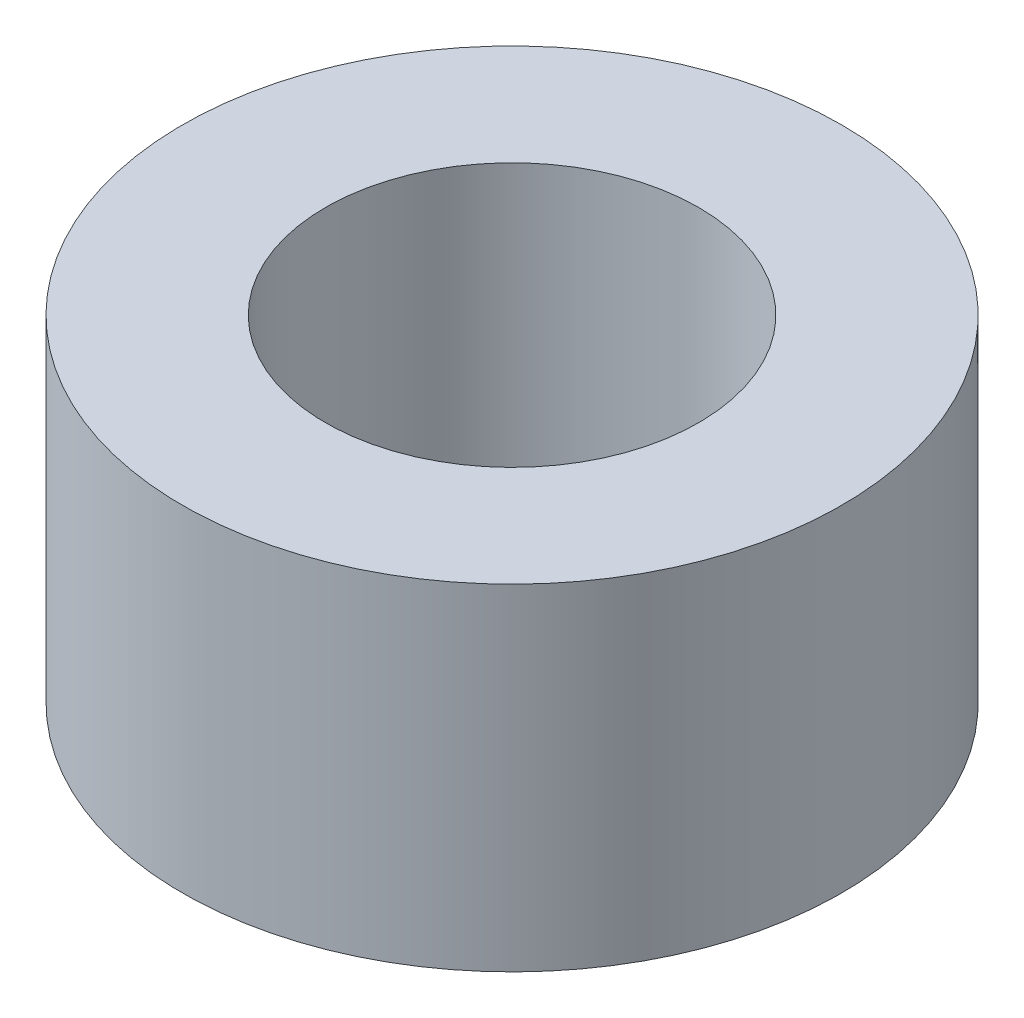
ISO-10303-21;
HEADER;
FILE_DESCRIPTION(('STEP AP214'),'2;1');
FILE_NAME('part.step','',(''),(''),'','','');
FILE_SCHEMA(('AUTOMOTIVE_DESIGN { 1 0 10303 214 1 1 1 1 }'));
ENDSEC;
DATA;
#1=APPLICATION_CONTEXT('core data for automotive mechanical design processes');
#2=APPLICATION_PROTOCOL_DEFINITION('international standard','automotive_design',2000,#1);
#3=PRODUCT_CONTEXT('',#1,'mechanical');
#4=PRODUCT('Part','Part','',(#3));
#5=PRODUCT_RELATED_PRODUCT_CATEGORY('part','',(#4));
#6=PRODUCT_DEFINITION_FORMATION('','',#4);
#7=PRODUCT_DEFINITION_CONTEXT('part definition',#1,'design');
#8=PRODUCT_DEFINITION('design','',#6,#7);
#9=PRODUCT_DEFINITION_SHAPE('','',#8);
#10=(LENGTH_UNIT() NAMED_UNIT(*) SI_UNIT(.MILLI.,.METRE.));
#11=(NAMED_UNIT(*) PLANE_ANGLE_UNIT() SI_UNIT($,.RADIAN.));
#12=(NAMED_UNIT(*) SI_UNIT($,.STERADIAN.) SOLID_ANGLE_UNIT());
#13=UNCERTAINTY_MEASURE_WITH_UNIT(LENGTH_MEASURE(1.E-05),#10,'distance_accuracy_value','');
#14=(GEOMETRIC_REPRESENTATION_CONTEXT(3) GLOBAL_UNCERTAINTY_ASSIGNED_CONTEXT((#13)) GLOBAL_UNIT_ASSIGNED_CONTEXT((#10,
#11,#12)) REPRESENTATION_CONTEXT('',''));
#15=CARTESIAN_POINT('',(0.,0.,0.));
#16=DIRECTION('',(0.,0.,1.));
#17=DIRECTION('',(1.,0.,0.));
#18=AXIS2_PLACEMENT_3D('',#15,#16,#17);
#19=CARTESIAN_POINT('',(0.,0.,0.));
#20=DIRECTION('',(0.,-1.,0.));
#21=DIRECTION('',(0.,0.,-1.));
#22=AXIS2_PLACEMENT_3D('',#19,#20,#21);
#23=CYLINDRICAL_SURFACE('',#22,19.05);
#24=CARTESIAN_POINT('',(0.,0.,0.));
#25=DIRECTION('',(0.,-1.,0.));
#26=DIRECTION('',(0.,0.,-1.));
#27=AXIS2_PLACEMENT_3D('',#24,#25,#26);
#28=CIRCLE('',#27,19.05);
#29=CARTESIAN_POINT('',(0.,0.,-19.05));
#30=VERTEX_POINT('',#29);
#31=EDGE_CURVE('E39',#30,#30,#28,.T.);
#32=ORIENTED_EDGE('',*,*,#31,.F.);
#33=EDGE_LOOP('',(#32));
#34=FACE_BOUND('',#33,.T.);
#35=CARTESIAN_POINT('',(0.,-34.29,0.));
#36=DIRECTION('',(0.,-1.,0.));
#37=DIRECTION('',(0.,0.,-1.));
#38=AXIS2_PLACEMENT_3D('',#35,#36,#37);
#39=CIRCLE('',#38,19.05);
#40=CARTESIAN_POINT('',(0.,-34.29,-19.05));
#41=VERTEX_POINT('',#40);
#42=EDGE_CURVE('E10',#41,#41,#39,.T.);
#43=ORIENTED_EDGE('',*,*,#42,.T.);
#44=EDGE_LOOP('',(#43));
#45=FACE_BOUND('',#44,.T.);
#46=ADVANCED_FACE('F33',(#34,#45),#23,.F.);
#47=CARTESIAN_POINT('',(0.,0.,19.05));
#48=DIRECTION('',(0.,-1.,0.));
#49=DIRECTION('',(0.,0.,-1.));
#50=AXIS2_PLACEMENT_3D('',#47,#48,#49);
#51=PLANE('',#50);
#52=CARTESIAN_POINT('',(0.,0.,0.));
#53=DIRECTION('',(0.,-1.,0.));
#54=DIRECTION('',(0.,0.,-1.));
#55=AXIS2_PLACEMENT_3D('',#52,#53,#54);
#56=CIRCLE('',#55,33.655);
#57=CARTESIAN_POINT('',(0.,0.,-33.655));
#58=VERTEX_POINT('',#57);
#59=EDGE_CURVE('E43',#58,#58,#56,.T.);
#60=ORIENTED_EDGE('',*,*,#59,.F.);
#61=EDGE_LOOP('',(#60));
#62=FACE_BOUND('',#61,.T.);
#63=ORIENTED_EDGE('',*,*,#31,.T.);
#64=EDGE_LOOP('',(#63));
#65=FACE_BOUND('',#64,.T.);
#66=ADVANCED_FACE('F58',(#62,#65),#51,.F.);
#67=CARTESIAN_POINT('',(0.,0.,0.));
#68=DIRECTION('',(0.,-1.,0.));
#69=DIRECTION('',(0.,0.,-1.));
#70=AXIS2_PLACEMENT_3D('',#67,#68,#69);
#71=CYLINDRICAL_SURFACE('',#70,33.655);
#72=CARTESIAN_POINT('',(0.,-34.29,0.));
#73=DIRECTION('',(0.,-1.,0.));
#74=DIRECTION('',(0.,0.,-1.));
#75=AXIS2_PLACEMENT_3D('',#72,#73,#74);
#76=CIRCLE('',#75,33.655);
#77=CARTESIAN_POINT('',(0.,-34.29,-33.655));
#78=VERTEX_POINT('',#77);
#79=EDGE_CURVE('E47',#78,#78,#76,.T.);
#80=ORIENTED_EDGE('',*,*,#79,.F.);
#81=EDGE_LOOP('',(#80));
#82=FACE_BOUND('',#81,.T.);
#83=ORIENTED_EDGE('',*,*,#59,.T.);
#84=EDGE_LOOP('',(#83));
#85=FACE_BOUND('',#84,.T.);
#86=ADVANCED_FACE('F55',(#82,#85),#71,.T.);
#87=CARTESIAN_POINT('',(0.,-34.29,22.225));
#88=DIRECTION('',(0.,1.,0.));
#89=DIRECTION('',(0.,0.,1.));
#90=AXIS2_PLACEMENT_3D('',#87,#88,#89);
#91=PLANE('',#90);
#92=ORIENTED_EDGE('',*,*,#42,.F.);
#93=EDGE_LOOP('',(#92));
#94=FACE_BOUND('',#93,.T.);
#95=ORIENTED_EDGE('',*,*,#79,.T.);
#96=EDGE_LOOP('',(#95));
#97=FACE_BOUND('',#96,.T.);
#98=ADVANCED_FACE('F53',(#94,#97),#91,.F.);
#99=CLOSED_SHELL('',(#46,#66,#86,#98));
#100=MANIFOLD_SOLID_BREP('B2',#99);
#101=ADVANCED_BREP_SHAPE_REPRESENTATION('',(#18,#100),#14);
#102=SHAPE_DEFINITION_REPRESENTATION(#9,#101);
ENDSEC;
END-ISO-10303-21;
